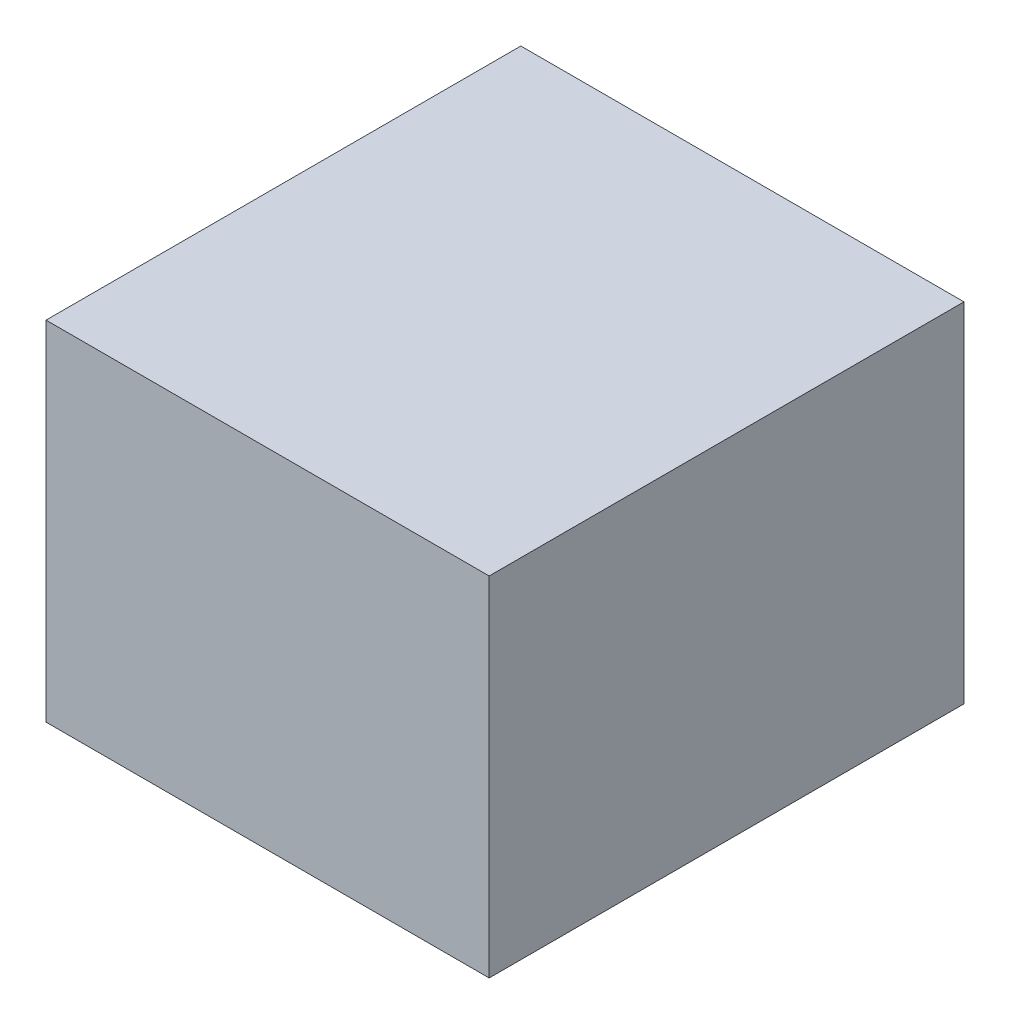
ISO-10303-21;
HEADER;
FILE_DESCRIPTION(('STEP AP214'),'2;1');
FILE_NAME('part.step','',(''),(''),'','','');
FILE_SCHEMA(('AUTOMOTIVE_DESIGN { 1 0 10303 214 1 1 1 1 }'));
ENDSEC;
DATA;
#1=APPLICATION_CONTEXT('core data for automotive mechanical design processes');
#2=APPLICATION_PROTOCOL_DEFINITION('international standard','automotive_design',2000,#1);
#3=PRODUCT_CONTEXT('',#1,'mechanical');
#4=PRODUCT('Part','Part','',(#3));
#5=PRODUCT_RELATED_PRODUCT_CATEGORY('part','',(#4));
#6=PRODUCT_DEFINITION_FORMATION('','',#4);
#7=PRODUCT_DEFINITION_CONTEXT('part definition',#1,'design');
#8=PRODUCT_DEFINITION('design','',#6,#7);
#9=PRODUCT_DEFINITION_SHAPE('','',#8);
#10=(LENGTH_UNIT() NAMED_UNIT(*) SI_UNIT(.MILLI.,.METRE.));
#11=(NAMED_UNIT(*) PLANE_ANGLE_UNIT() SI_UNIT($,.RADIAN.));
#12=(NAMED_UNIT(*) SI_UNIT($,.STERADIAN.) SOLID_ANGLE_UNIT());
#13=UNCERTAINTY_MEASURE_WITH_UNIT(LENGTH_MEASURE(1.E-05),#10,'distance_accuracy_value','');
#14=(GEOMETRIC_REPRESENTATION_CONTEXT(3) GLOBAL_UNCERTAINTY_ASSIGNED_CONTEXT((#13)) GLOBAL_UNIT_ASSIGNED_CONTEXT((#10,
#11,#12)) REPRESENTATION_CONTEXT('',''));
#15=CARTESIAN_POINT('',(0.,0.,0.));
#16=DIRECTION('',(0.,0.,1.));
#17=DIRECTION('',(1.,0.,0.));
#18=AXIS2_PLACEMENT_3D('',#15,#16,#17);
#19=CARTESIAN_POINT('',(14.,11.,15.));
#20=DIRECTION('',(-1.,0.,0.));
#21=DIRECTION('',(0.,-1.,0.));
#22=AXIS2_PLACEMENT_3D('',#19,#20,#21);
#23=PLANE('',#22);
#24=DIRECTION('',(0.,1.,0.));
#25=VECTOR('',#24,1.);
#26=CARTESIAN_POINT('',(14.,11.,-15.));
#27=LINE('',#26,#25);
#28=CARTESIAN_POINT('',(14.,-11.,-15.));
#29=VERTEX_POINT('',#28);
#30=CARTESIAN_POINT('',(14.,11.,-15.));
#31=VERTEX_POINT('',#30);
#32=EDGE_CURVE('E102',#29,#31,#27,.T.);
#33=ORIENTED_EDGE('',*,*,#32,.T.);
#34=DIRECTION('',(0.,0.,-1.));
#35=VECTOR('',#34,1.);
#36=CARTESIAN_POINT('',(14.,11.,15.));
#37=LINE('',#36,#35);
#38=CARTESIAN_POINT('',(14.,11.,15.));
#39=VERTEX_POINT('',#38);
#40=EDGE_CURVE('E11',#39,#31,#37,.T.);
#41=ORIENTED_EDGE('',*,*,#40,.F.);
#42=DIRECTION('',(0.,1.,0.));
#43=VECTOR('',#42,1.);
#44=CARTESIAN_POINT('',(14.,11.,15.));
#45=LINE('',#44,#43);
#46=CARTESIAN_POINT('',(14.,-11.,15.));
#47=VERTEX_POINT('',#46);
#48=EDGE_CURVE('E90',#47,#39,#45,.T.);
#49=ORIENTED_EDGE('',*,*,#48,.F.);
#50=DIRECTION('',(0.,0.,-1.));
#51=VECTOR('',#50,1.);
#52=CARTESIAN_POINT('',(14.,-11.,15.));
#53=LINE('',#52,#51);
#54=EDGE_CURVE('E98',#47,#29,#53,.T.);
#55=ORIENTED_EDGE('',*,*,#54,.T.);
#56=EDGE_LOOP('',(#33,#41,#49,#55));
#57=FACE_BOUND('',#56,.T.);
#58=ADVANCED_FACE('F39',(#57),#23,.F.);
#59=CARTESIAN_POINT('',(-14.,11.,15.));
#60=DIRECTION('',(0.,-1.,0.));
#61=DIRECTION('',(0.,0.,-1.));
#62=AXIS2_PLACEMENT_3D('',#59,#60,#61);
#63=PLANE('',#62);
#64=DIRECTION('',(-1.,0.,0.));
#65=VECTOR('',#64,1.);
#66=CARTESIAN_POINT('',(-14.,11.,-15.));
#67=LINE('',#66,#65);
#68=CARTESIAN_POINT('',(-14.,11.,-15.));
#69=VERTEX_POINT('',#68);
#70=EDGE_CURVE('E94',#31,#69,#67,.T.);
#71=ORIENTED_EDGE('',*,*,#70,.T.);
#72=DIRECTION('',(0.,0.,-1.));
#73=VECTOR('',#72,1.);
#74=CARTESIAN_POINT('',(-14.,11.,15.));
#75=LINE('',#74,#73);
#76=CARTESIAN_POINT('',(-14.,11.,15.));
#77=VERTEX_POINT('',#76);
#78=EDGE_CURVE('E47',#77,#69,#75,.T.);
#79=ORIENTED_EDGE('',*,*,#78,.F.);
#80=DIRECTION('',(-1.,0.,0.));
#81=VECTOR('',#80,1.);
#82=CARTESIAN_POINT('',(-14.,11.,15.));
#83=LINE('',#82,#81);
#84=EDGE_CURVE('E85',#39,#77,#83,.T.);
#85=ORIENTED_EDGE('',*,*,#84,.F.);
#86=ORIENTED_EDGE('',*,*,#40,.T.);
#87=EDGE_LOOP('',(#71,#79,#85,#86));
#88=FACE_BOUND('',#87,.T.);
#89=ADVANCED_FACE('F93',(#88),#63,.F.);
#90=CARTESIAN_POINT('',(-14.,11.,15.));
#91=DIRECTION('',(1.,0.,0.));
#92=DIRECTION('',(0.,1.,0.));
#93=AXIS2_PLACEMENT_3D('',#90,#91,#92);
#94=PLANE('',#93);
#95=DIRECTION('',(0.,-1.,0.));
#96=VECTOR('',#95,1.);
#97=CARTESIAN_POINT('',(-14.,11.,-15.));
#98=LINE('',#97,#96);
#99=CARTESIAN_POINT('',(-14.,-11.,-15.));
#100=VERTEX_POINT('',#99);
#101=EDGE_CURVE('E72',#69,#100,#98,.T.);
#102=ORIENTED_EDGE('',*,*,#101,.T.);
#103=DIRECTION('',(0.,0.,-1.));
#104=VECTOR('',#103,1.);
#105=CARTESIAN_POINT('',(-14.,-11.,15.));
#106=LINE('',#105,#104);
#107=CARTESIAN_POINT('',(-14.,-11.,15.));
#108=VERTEX_POINT('',#107);
#109=EDGE_CURVE('E95',#108,#100,#106,.T.);
#110=ORIENTED_EDGE('',*,*,#109,.F.);
#111=DIRECTION('',(0.,-1.,0.));
#112=VECTOR('',#111,1.);
#113=CARTESIAN_POINT('',(-14.,11.,15.));
#114=LINE('',#113,#112);
#115=EDGE_CURVE('E88',#77,#108,#114,.T.);
#116=ORIENTED_EDGE('',*,*,#115,.F.);
#117=ORIENTED_EDGE('',*,*,#78,.T.);
#118=EDGE_LOOP('',(#102,#110,#116,#117));
#119=FACE_BOUND('',#118,.T.);
#120=ADVANCED_FACE('F96',(#119),#94,.F.);
#121=CARTESIAN_POINT('',(-14.,-11.,15.));
#122=DIRECTION('',(0.,1.,0.));
#123=DIRECTION('',(0.,0.,1.));
#124=AXIS2_PLACEMENT_3D('',#121,#122,#123);
#125=PLANE('',#124);
#126=DIRECTION('',(1.,0.,0.));
#127=VECTOR('',#126,1.);
#128=CARTESIAN_POINT('',(-14.,-11.,-15.));
#129=LINE('',#128,#127);
#130=EDGE_CURVE('E78',#100,#29,#129,.T.);
#131=ORIENTED_EDGE('',*,*,#130,.T.);
#132=ORIENTED_EDGE('',*,*,#54,.F.);
#133=DIRECTION('',(1.,0.,0.));
#134=VECTOR('',#133,1.);
#135=CARTESIAN_POINT('',(-14.,-11.,15.));
#136=LINE('',#135,#134);
#137=EDGE_CURVE('E55',#108,#47,#136,.T.);
#138=ORIENTED_EDGE('',*,*,#137,.F.);
#139=ORIENTED_EDGE('',*,*,#109,.T.);
#140=EDGE_LOOP('',(#131,#132,#138,#139));
#141=FACE_BOUND('',#140,.T.);
#142=ADVANCED_FACE('F109',(#141),#125,.F.);
#143=CARTESIAN_POINT('',(0.,0.,15.));
#144=DIRECTION('',(0.,0.,1.));
#145=DIRECTION('',(1.,0.,0.));
#146=AXIS2_PLACEMENT_3D('',#143,#144,#145);
#147=PLANE('',#146);
#148=ORIENTED_EDGE('',*,*,#48,.T.);
#149=ORIENTED_EDGE('',*,*,#84,.T.);
#150=ORIENTED_EDGE('',*,*,#115,.T.);
#151=ORIENTED_EDGE('',*,*,#137,.T.);
#152=EDGE_LOOP('',(#148,#149,#150,#151));
#153=FACE_BOUND('',#152,.T.);
#154=ADVANCED_FACE('F86',(#153),#147,.T.);
#155=CARTESIAN_POINT('',(0.,0.,-15.));
#156=DIRECTION('',(0.,0.,1.));
#157=DIRECTION('',(1.,0.,0.));
#158=AXIS2_PLACEMENT_3D('',#155,#156,#157);
#159=PLANE('',#158);
#160=ORIENTED_EDGE('',*,*,#32,.F.);
#161=ORIENTED_EDGE('',*,*,#130,.F.);
#162=ORIENTED_EDGE('',*,*,#101,.F.);
#163=ORIENTED_EDGE('',*,*,#70,.F.);
#164=EDGE_LOOP('',(#160,#161,#162,#163));
#165=FACE_BOUND('',#164,.T.);
#166=ADVANCED_FACE('F112',(#165),#159,.F.);
#167=CLOSED_SHELL('',(#58,#89,#120,#142,#154,#166));
#168=MANIFOLD_SOLID_BREP('B2',#167);
#169=ADVANCED_BREP_SHAPE_REPRESENTATION('',(#18,#168),#14);
#170=SHAPE_DEFINITION_REPRESENTATION(#9,#169);
ENDSEC;
END-ISO-10303-21;
